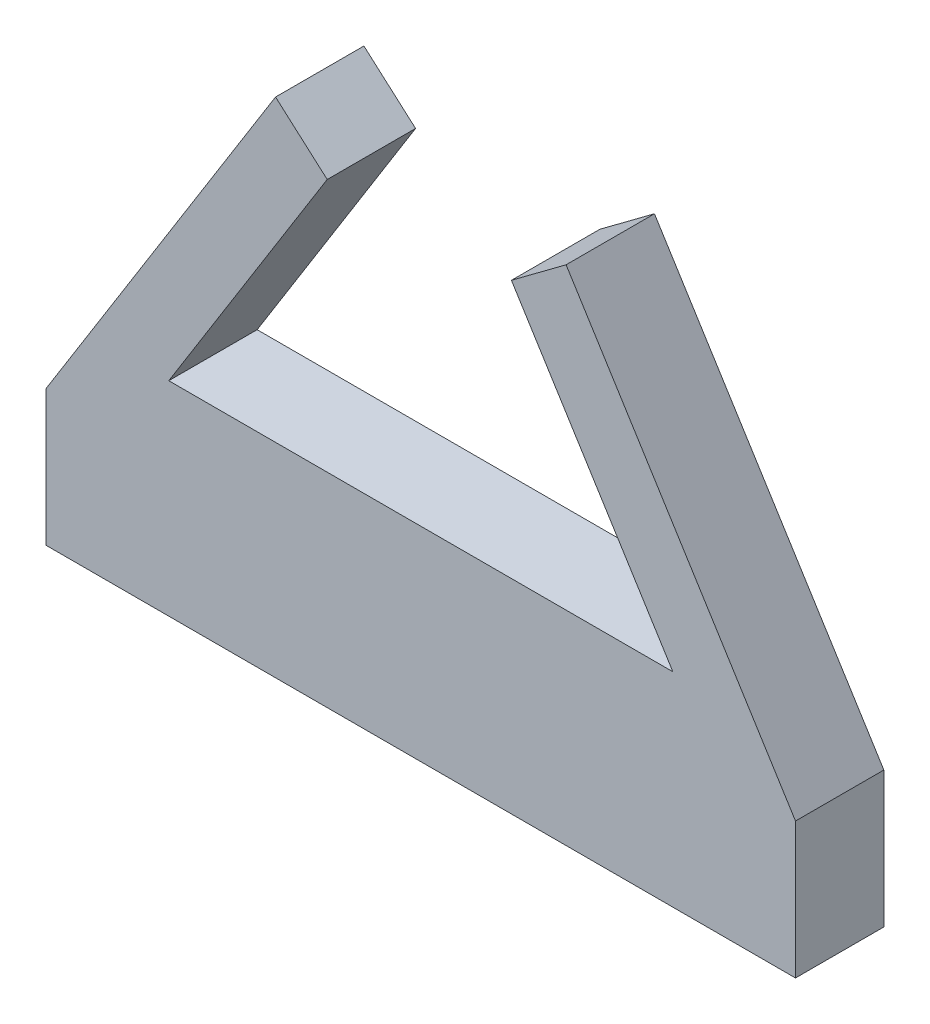
ISO-10303-21;
HEADER;
FILE_DESCRIPTION(('STEP AP214'),'2;1');
FILE_NAME('part.step','',(''),(''),'','','');
FILE_SCHEMA(('AUTOMOTIVE_DESIGN { 1 0 10303 214 1 1 1 1 }'));
ENDSEC;
DATA;
#1=APPLICATION_CONTEXT('core data for automotive mechanical design processes');
#2=APPLICATION_PROTOCOL_DEFINITION('international standard','automotive_design',2000,#1);
#3=PRODUCT_CONTEXT('',#1,'mechanical');
#4=PRODUCT('Part','Part','',(#3));
#5=PRODUCT_RELATED_PRODUCT_CATEGORY('part','',(#4));
#6=PRODUCT_DEFINITION_FORMATION('','',#4);
#7=PRODUCT_DEFINITION_CONTEXT('part definition',#1,'design');
#8=PRODUCT_DEFINITION('design','',#6,#7);
#9=PRODUCT_DEFINITION_SHAPE('','',#8);
#10=(LENGTH_UNIT() NAMED_UNIT(*) SI_UNIT(.MILLI.,.METRE.));
#11=(NAMED_UNIT(*) PLANE_ANGLE_UNIT() SI_UNIT($,.RADIAN.));
#12=(NAMED_UNIT(*) SI_UNIT($,.STERADIAN.) SOLID_ANGLE_UNIT());
#13=UNCERTAINTY_MEASURE_WITH_UNIT(LENGTH_MEASURE(1.E-05),#10,'distance_accuracy_value','');
#14=(GEOMETRIC_REPRESENTATION_CONTEXT(3) GLOBAL_UNCERTAINTY_ASSIGNED_CONTEXT((#13)) GLOBAL_UNIT_ASSIGNED_CONTEXT((#10,
#11,#12)) REPRESENTATION_CONTEXT('',''));
#15=CARTESIAN_POINT('',(0.,0.,0.));
#16=DIRECTION('',(0.,0.,1.));
#17=DIRECTION('',(1.,0.,0.));
#18=AXIS2_PLACEMENT_3D('',#15,#16,#17);
#19=CARTESIAN_POINT('',(-2.95102870468467,1.84439294042792,2.6));
#20=DIRECTION('',(-0.847998304005088,0.52999894000318,0.));
#21=DIRECTION('',(-0.52999894000318,-0.847998304005088,0.));
#22=AXIS2_PLACEMENT_3D('',#19,#20,#21);
#23=PLANE('',#22);
#24=DIRECTION('',(0.52999894000318,0.847998304005088,0.));
#25=VECTOR('',#24,1.);
#26=CARTESIAN_POINT('',(-2.95102870468467,1.84439294042792,0.));
#27=LINE('',#26,#25);
#28=CARTESIAN_POINT('',(-7.41627429245213,-5.3,0.));
#29=VERTEX_POINT('',#28);
#30=CARTESIAN_POINT('',(-2.75439949120153,2.15899968200095,0.));
#31=VERTEX_POINT('',#30);
#32=EDGE_CURVE('E136',#29,#31,#27,.T.);
#33=ORIENTED_EDGE('',*,*,#32,.T.);
#34=DIRECTION('',(0.,0.,-1.));
#35=VECTOR('',#34,1.);
#36=CARTESIAN_POINT('',(-2.75439949120153,2.15899968200095,2.6));
#37=LINE('',#36,#35);
#38=CARTESIAN_POINT('',(-2.75439949120153,2.15899968200095,2.6));
#39=VERTEX_POINT('',#38);
#40=EDGE_CURVE('E11',#39,#31,#37,.T.);
#41=ORIENTED_EDGE('',*,*,#40,.F.);
#42=DIRECTION('',(0.52999894000318,0.847998304005088,0.));
#43=VECTOR('',#42,1.);
#44=CARTESIAN_POINT('',(-2.95102870468467,1.84439294042792,2.6));
#45=LINE('',#44,#43);
#46=CARTESIAN_POINT('',(-7.41627429245213,-5.3,2.6));
#47=VERTEX_POINT('',#46);
#48=EDGE_CURVE('E152',#47,#39,#45,.T.);
#49=ORIENTED_EDGE('',*,*,#48,.F.);
#50=DIRECTION('',(0.,0.,-1.));
#51=VECTOR('',#50,1.);
#52=CARTESIAN_POINT('',(-7.41627429245213,-5.3,2.6));
#53=LINE('',#52,#51);
#54=EDGE_CURVE('E132',#47,#29,#53,.T.);
#55=ORIENTED_EDGE('',*,*,#54,.T.);
#56=EDGE_LOOP('',(#33,#41,#49,#55));
#57=FACE_BOUND('',#56,.T.);
#58=ADVANCED_FACE('F40',(#57),#23,.F.);
#59=CARTESIAN_POINT('',(-0.134162471362266,-0.152107799791261,2.6));
#60=DIRECTION('',(-0.66148220382676,-0.749960861659122,0.));
#61=DIRECTION('',(0.749960861659122,-0.66148220382676,0.));
#62=AXIS2_PLACEMENT_3D('',#59,#60,#61);
#63=PLANE('',#62);
#64=DIRECTION('',(-0.749960861659122,0.66148220382676,0.));
#65=VECTOR('',#64,1.);
#66=CARTESIAN_POINT('',(-0.134162471362266,-0.152107799791261,0.));
#67=LINE('',#66,#65);
#68=CARTESIAN_POINT('',(-4.27476957546627,3.5,0.));
#69=VERTEX_POINT('',#68);
#70=EDGE_CURVE('E139',#31,#69,#67,.T.);
#71=ORIENTED_EDGE('',*,*,#70,.T.);
#72=DIRECTION('',(0.,0.,-1.));
#73=VECTOR('',#72,1.);
#74=CARTESIAN_POINT('',(-4.27476957546627,3.5,2.6));
#75=LINE('',#74,#73);
#76=CARTESIAN_POINT('',(-4.27476957546627,3.5,2.6));
#77=VERTEX_POINT('',#76);
#78=EDGE_CURVE('E48',#77,#69,#75,.T.);
#79=ORIENTED_EDGE('',*,*,#78,.F.);
#80=DIRECTION('',(-0.749960861659122,0.66148220382676,0.));
#81=VECTOR('',#80,1.);
#82=CARTESIAN_POINT('',(-0.134162471362266,-0.152107799791261,2.6));
#83=LINE('',#82,#81);
#84=EDGE_CURVE('E97',#39,#77,#83,.T.);
#85=ORIENTED_EDGE('',*,*,#84,.F.);
#86=ORIENTED_EDGE('',*,*,#40,.T.);
#87=EDGE_LOOP('',(#71,#79,#85,#86));
#88=FACE_BOUND('',#87,.T.);
#89=ADVANCED_FACE('F167',(#88),#63,.F.);
#90=CARTESIAN_POINT('',(-4.64702531269485,2.90439082043428,2.6));
#91=DIRECTION('',(-0.847998304005088,0.52999894000318,0.));
#92=DIRECTION('',(-0.52999894000318,-0.847998304005088,0.));
#93=AXIS2_PLACEMENT_3D('',#90,#91,#92);
#94=PLANE('',#93);
#95=DIRECTION('',(0.52999894000318,0.847998304005088,0.));
#96=VECTOR('',#95,1.);
#97=CARTESIAN_POINT('',(-4.64702531269485,2.90439082043428,0.));
#98=LINE('',#97,#96);
#99=CARTESIAN_POINT('',(-11.0247695754663,-7.3,0.));
#100=VERTEX_POINT('',#99);
#101=EDGE_CURVE('E143',#100,#69,#98,.T.);
#102=ORIENTED_EDGE('',*,*,#101,.F.);
#103=DIRECTION('',(0.,0.,-1.));
#104=VECTOR('',#103,1.);
#105=CARTESIAN_POINT('',(-11.0247695754663,-7.3,2.6));
#106=LINE('',#105,#104);
#107=CARTESIAN_POINT('',(-11.0247695754663,-7.3,2.6));
#108=VERTEX_POINT('',#107);
#109=EDGE_CURVE('E158',#108,#100,#106,.T.);
#110=ORIENTED_EDGE('',*,*,#109,.F.);
#111=DIRECTION('',(0.52999894000318,0.847998304005088,0.));
#112=VECTOR('',#111,1.);
#113=CARTESIAN_POINT('',(-4.64702531269485,2.90439082043428,2.6));
#114=LINE('',#113,#112);
#115=EDGE_CURVE('E166',#108,#77,#114,.T.);
#116=ORIENTED_EDGE('',*,*,#115,.T.);
#117=ORIENTED_EDGE('',*,*,#78,.T.);
#118=EDGE_LOOP('',(#102,#110,#116,#117));
#119=FACE_BOUND('',#118,.T.);
#120=ADVANCED_FACE('F163',(#119),#94,.T.);
#121=CARTESIAN_POINT('',(4.64702531269485,2.90439082043428,2.6));
#122=DIRECTION('',(0.847998304005088,0.52999894000318,0.));
#123=DIRECTION('',(-0.52999894000318,0.847998304005088,0.));
#124=AXIS2_PLACEMENT_3D('',#121,#122,#123);
#125=PLANE('',#124);
#126=DIRECTION('',(0.52999894000318,-0.847998304005088,0.));
#127=VECTOR('',#126,1.);
#128=CARTESIAN_POINT('',(4.64702531269485,2.90439082043428,0.));
#129=LINE('',#128,#127);
#130=CARTESIAN_POINT('',(4.27476957546627,3.5,0.));
#131=VERTEX_POINT('',#130);
#132=CARTESIAN_POINT('',(11.0247695754663,-7.3,0.));
#133=VERTEX_POINT('',#132);
#134=EDGE_CURVE('E146',#131,#133,#129,.T.);
#135=ORIENTED_EDGE('',*,*,#134,.F.);
#136=DIRECTION('',(0.,0.,-1.));
#137=VECTOR('',#136,1.);
#138=CARTESIAN_POINT('',(4.27476957546627,3.5,2.6));
#139=LINE('',#138,#137);
#140=CARTESIAN_POINT('',(4.27476957546627,3.5,2.6));
#141=VERTEX_POINT('',#140);
#142=EDGE_CURVE('E127',#141,#131,#139,.T.);
#143=ORIENTED_EDGE('',*,*,#142,.F.);
#144=DIRECTION('',(0.52999894000318,-0.847998304005088,0.));
#145=VECTOR('',#144,1.);
#146=CARTESIAN_POINT('',(4.64702531269485,2.90439082043428,2.6));
#147=LINE('',#146,#145);
#148=CARTESIAN_POINT('',(11.0247695754663,-7.3,2.6));
#149=VERTEX_POINT('',#148);
#150=EDGE_CURVE('E120',#141,#149,#147,.T.);
#151=ORIENTED_EDGE('',*,*,#150,.T.);
#152=DIRECTION('',(0.,0.,-1.));
#153=VECTOR('',#152,1.);
#154=CARTESIAN_POINT('',(11.0247695754663,-7.3,2.6));
#155=LINE('',#154,#153);
#156=EDGE_CURVE('E156',#149,#133,#155,.T.);
#157=ORIENTED_EDGE('',*,*,#156,.T.);
#158=EDGE_LOOP('',(#135,#143,#151,#157));
#159=FACE_BOUND('',#158,.T.);
#160=ADVANCED_FACE('F219',(#159),#125,.T.);
#161=CARTESIAN_POINT('',(-0.148987757360057,0.199705087450423,2.6));
#162=DIRECTION('',(0.597966108071316,-0.801521386862536,0.));
#163=DIRECTION('',(0.801521386862536,0.597966108071316,0.));
#164=AXIS2_PLACEMENT_3D('',#161,#162,#163);
#165=PLANE('',#164);
#166=DIRECTION('',(-0.801521386862536,-0.597966108071316,0.));
#167=VECTOR('',#166,1.);
#168=CARTESIAN_POINT('',(-0.148987757360057,0.199705087450423,0.));
#169=LINE('',#168,#167);
#170=CARTESIAN_POINT('',(2.66627429245212,2.3,0.));
#171=VERTEX_POINT('',#170);
#172=EDGE_CURVE('E126',#131,#171,#169,.T.);
#173=ORIENTED_EDGE('',*,*,#172,.T.);
#174=DIRECTION('',(0.,0.,-1.));
#175=VECTOR('',#174,1.);
#176=CARTESIAN_POINT('',(2.66627429245212,2.3,2.6));
#177=LINE('',#176,#175);
#178=CARTESIAN_POINT('',(2.66627429245212,2.3,2.6));
#179=VERTEX_POINT('',#178);
#180=EDGE_CURVE('E123',#179,#171,#177,.T.);
#181=ORIENTED_EDGE('',*,*,#180,.F.);
#182=DIRECTION('',(-0.801521386862536,-0.597966108071316,0.));
#183=VECTOR('',#182,1.);
#184=CARTESIAN_POINT('',(-0.148987757360057,0.199705087450423,2.6));
#185=LINE('',#184,#183);
#186=EDGE_CURVE('E114',#141,#179,#185,.T.);
#187=ORIENTED_EDGE('',*,*,#186,.F.);
#188=ORIENTED_EDGE('',*,*,#142,.T.);
#189=EDGE_LOOP('',(#173,#181,#187,#188));
#190=FACE_BOUND('',#189,.T.);
#191=ADVANCED_FACE('F124',(#190),#165,.F.);
#192=CARTESIAN_POINT('',(2.95102870468467,1.84439294042792,2.6));
#193=DIRECTION('',(0.847998304005088,0.52999894000318,0.));
#194=DIRECTION('',(-0.52999894000318,0.847998304005088,0.));
#195=AXIS2_PLACEMENT_3D('',#192,#193,#194);
#196=PLANE('',#195);
#197=DIRECTION('',(0.52999894000318,-0.847998304005088,0.));
#198=VECTOR('',#197,1.);
#199=CARTESIAN_POINT('',(2.95102870468467,1.84439294042792,0.));
#200=LINE('',#199,#198);
#201=CARTESIAN_POINT('',(7.41627429245212,-5.3,0.));
#202=VERTEX_POINT('',#201);
#203=EDGE_CURVE('E83',#171,#202,#200,.T.);
#204=ORIENTED_EDGE('',*,*,#203,.T.);
#205=DIRECTION('',(0.,0.,-1.));
#206=VECTOR('',#205,1.);
#207=CARTESIAN_POINT('',(7.41627429245212,-5.3,2.6));
#208=LINE('',#207,#206);
#209=CARTESIAN_POINT('',(7.41627429245212,-5.3,2.6));
#210=VERTEX_POINT('',#209);
#211=EDGE_CURVE('E128',#210,#202,#208,.T.);
#212=ORIENTED_EDGE('',*,*,#211,.F.);
#213=DIRECTION('',(0.52999894000318,-0.847998304005088,0.));
#214=VECTOR('',#213,1.);
#215=CARTESIAN_POINT('',(2.95102870468467,1.84439294042792,2.6));
#216=LINE('',#215,#214);
#217=EDGE_CURVE('E118',#179,#210,#216,.T.);
#218=ORIENTED_EDGE('',*,*,#217,.F.);
#219=ORIENTED_EDGE('',*,*,#180,.T.);
#220=EDGE_LOOP('',(#204,#212,#218,#219));
#221=FACE_BOUND('',#220,.T.);
#222=ADVANCED_FACE('F130',(#221),#196,.F.);
#223=CARTESIAN_POINT('',(0.,-5.3,2.6));
#224=DIRECTION('',(0.,-1.,0.));
#225=DIRECTION('',(0.,0.,-1.));
#226=AXIS2_PLACEMENT_3D('',#223,#224,#225);
#227=PLANE('',#226);
#228=DIRECTION('',(-1.,0.,0.));
#229=VECTOR('',#228,1.);
#230=CARTESIAN_POINT('',(0.,-5.3,0.));
#231=LINE('',#230,#229);
#232=EDGE_CURVE('E89',#202,#29,#231,.T.);
#233=ORIENTED_EDGE('',*,*,#232,.T.);
#234=ORIENTED_EDGE('',*,*,#54,.F.);
#235=DIRECTION('',(-1.,0.,0.));
#236=VECTOR('',#235,1.);
#237=CARTESIAN_POINT('',(0.,-5.3,2.6));
#238=LINE('',#237,#236);
#239=EDGE_CURVE('E56',#210,#47,#238,.T.);
#240=ORIENTED_EDGE('',*,*,#239,.F.);
#241=ORIENTED_EDGE('',*,*,#211,.T.);
#242=EDGE_LOOP('',(#233,#234,#240,#241));
#243=FACE_BOUND('',#242,.T.);
#244=ADVANCED_FACE('F222',(#243),#227,.F.);
#245=CARTESIAN_POINT('',(0.,0.,2.6));
#246=DIRECTION('',(0.,0.,1.));
#247=DIRECTION('',(1.,0.,0.));
#248=AXIS2_PLACEMENT_3D('',#245,#246,#247);
#249=PLANE('',#248);
#250=ORIENTED_EDGE('',*,*,#48,.T.);
#251=ORIENTED_EDGE('',*,*,#84,.T.);
#252=ORIENTED_EDGE('',*,*,#115,.F.);
#253=DIRECTION('',(0.,1.,0.));
#254=VECTOR('',#253,1.);
#255=CARTESIAN_POINT('',(-11.0247695754663,-11.3,2.6));
#256=LINE('',#255,#254);
#257=CARTESIAN_POINT('',(-11.0247695754663,-11.3,2.6));
#258=VERTEX_POINT('',#257);
#259=EDGE_CURVE('E186',#258,#108,#256,.T.);
#260=ORIENTED_EDGE('',*,*,#259,.F.);
#261=DIRECTION('',(-1.,0.,0.));
#262=VECTOR('',#261,1.);
#263=CARTESIAN_POINT('',(-11.0247695754663,-11.3,2.6));
#264=LINE('',#263,#262);
#265=CARTESIAN_POINT('',(11.0247695754663,-11.3,2.6));
#266=VERTEX_POINT('',#265);
#267=EDGE_CURVE('E197',#266,#258,#264,.T.);
#268=ORIENTED_EDGE('',*,*,#267,.F.);
#269=DIRECTION('',(0.,1.,0.));
#270=VECTOR('',#269,1.);
#271=CARTESIAN_POINT('',(11.0247695754663,-11.3,2.6));
#272=LINE('',#271,#270);
#273=EDGE_CURVE('E194',#266,#149,#272,.T.);
#274=ORIENTED_EDGE('',*,*,#273,.T.);
#275=ORIENTED_EDGE('',*,*,#150,.F.);
#276=ORIENTED_EDGE('',*,*,#186,.T.);
#277=ORIENTED_EDGE('',*,*,#217,.T.);
#278=ORIENTED_EDGE('',*,*,#239,.T.);
#279=EDGE_LOOP('',(#250,#251,#252,#260,#268,#274,#275,#276,#277,#278));
#280=FACE_BOUND('',#279,.T.);
#281=ADVANCED_FACE('F116',(#280),#249,.T.);
#282=CARTESIAN_POINT('',(0.,0.,0.));
#283=DIRECTION('',(0.,0.,1.));
#284=DIRECTION('',(1.,0.,0.));
#285=AXIS2_PLACEMENT_3D('',#282,#283,#284);
#286=PLANE('',#285);
#287=ORIENTED_EDGE('',*,*,#32,.F.);
#288=ORIENTED_EDGE('',*,*,#232,.F.);
#289=ORIENTED_EDGE('',*,*,#203,.F.);
#290=ORIENTED_EDGE('',*,*,#172,.F.);
#291=ORIENTED_EDGE('',*,*,#134,.T.);
#292=DIRECTION('',(0.,1.,0.));
#293=VECTOR('',#292,1.);
#294=CARTESIAN_POINT('',(11.0247695754663,-11.3,0.));
#295=LINE('',#294,#293);
#296=CARTESIAN_POINT('',(11.0247695754663,-11.3,0.));
#297=VERTEX_POINT('',#296);
#298=EDGE_CURVE('E181',#297,#133,#295,.T.);
#299=ORIENTED_EDGE('',*,*,#298,.F.);
#300=DIRECTION('',(1.,0.,0.));
#301=VECTOR('',#300,1.);
#302=CARTESIAN_POINT('',(-11.0247695754663,-11.3,0.));
#303=LINE('',#302,#301);
#304=CARTESIAN_POINT('',(-11.0247695754663,-11.3,0.));
#305=VERTEX_POINT('',#304);
#306=EDGE_CURVE('E177',#305,#297,#303,.T.);
#307=ORIENTED_EDGE('',*,*,#306,.F.);
#308=DIRECTION('',(0.,1.,0.));
#309=VECTOR('',#308,1.);
#310=CARTESIAN_POINT('',(-11.0247695754663,-11.3,0.));
#311=LINE('',#310,#309);
#312=EDGE_CURVE('E140',#305,#100,#311,.T.);
#313=ORIENTED_EDGE('',*,*,#312,.T.);
#314=ORIENTED_EDGE('',*,*,#101,.T.);
#315=ORIENTED_EDGE('',*,*,#70,.F.);
#316=EDGE_LOOP('',(#287,#288,#289,#290,#291,#299,#307,#313,#314,#315));
#317=FACE_BOUND('',#316,.T.);
#318=ADVANCED_FACE('F171',(#317),#286,.F.);
#319=CARTESIAN_POINT('',(-11.0247695754663,-11.3,2.6));
#320=DIRECTION('',(1.,0.,0.));
#321=DIRECTION('',(0.,1.,0.));
#322=AXIS2_PLACEMENT_3D('',#319,#320,#321);
#323=PLANE('',#322);
#324=ORIENTED_EDGE('',*,*,#109,.T.);
#325=ORIENTED_EDGE('',*,*,#312,.F.);
#326=DIRECTION('',(0.,0.,-1.));
#327=VECTOR('',#326,1.);
#328=CARTESIAN_POINT('',(-11.0247695754663,-11.3,2.6));
#329=LINE('',#328,#327);
#330=EDGE_CURVE('E204',#258,#305,#329,.T.);
#331=ORIENTED_EDGE('',*,*,#330,.F.);
#332=ORIENTED_EDGE('',*,*,#259,.T.);
#333=EDGE_LOOP('',(#324,#325,#331,#332));
#334=FACE_BOUND('',#333,.T.);
#335=ADVANCED_FACE('F184',(#334),#323,.F.);
#336=CARTESIAN_POINT('',(11.0247695754663,-11.3,2.6));
#337=DIRECTION('',(-1.,0.,0.));
#338=DIRECTION('',(0.,-1.,0.));
#339=AXIS2_PLACEMENT_3D('',#336,#337,#338);
#340=PLANE('',#339);
#341=ORIENTED_EDGE('',*,*,#156,.F.);
#342=ORIENTED_EDGE('',*,*,#273,.F.);
#343=DIRECTION('',(0.,0.,1.));
#344=VECTOR('',#343,1.);
#345=CARTESIAN_POINT('',(11.0247695754663,-11.3,2.6));
#346=LINE('',#345,#344);
#347=EDGE_CURVE('E200',#297,#266,#346,.T.);
#348=ORIENTED_EDGE('',*,*,#347,.F.);
#349=ORIENTED_EDGE('',*,*,#298,.T.);
#350=EDGE_LOOP('',(#341,#342,#348,#349));
#351=FACE_BOUND('',#350,.T.);
#352=ADVANCED_FACE('F216',(#351),#340,.F.);
#353=CARTESIAN_POINT('',(0.,-11.3,0.));
#354=DIRECTION('',(0.,-1.,0.));
#355=DIRECTION('',(1.,0.,0.));
#356=AXIS2_PLACEMENT_3D('',#353,#354,#355);
#357=PLANE('',#356);
#358=ORIENTED_EDGE('',*,*,#330,.T.);
#359=ORIENTED_EDGE('',*,*,#306,.T.);
#360=ORIENTED_EDGE('',*,*,#347,.T.);
#361=ORIENTED_EDGE('',*,*,#267,.T.);
#362=EDGE_LOOP('',(#358,#359,#360,#361));
#363=FACE_BOUND('',#362,.T.);
#364=ADVANCED_FACE('F206',(#363),#357,.T.);
#365=CLOSED_SHELL('',(#58,#89,#120,#160,#191,#222,#244,#281,#318,#335,#352,#364));
#366=MANIFOLD_SOLID_BREP('B2',#365);
#367=ADVANCED_BREP_SHAPE_REPRESENTATION('',(#18,#366),#14);
#368=SHAPE_DEFINITION_REPRESENTATION(#9,#367);
ENDSEC;
END-ISO-10303-21;
